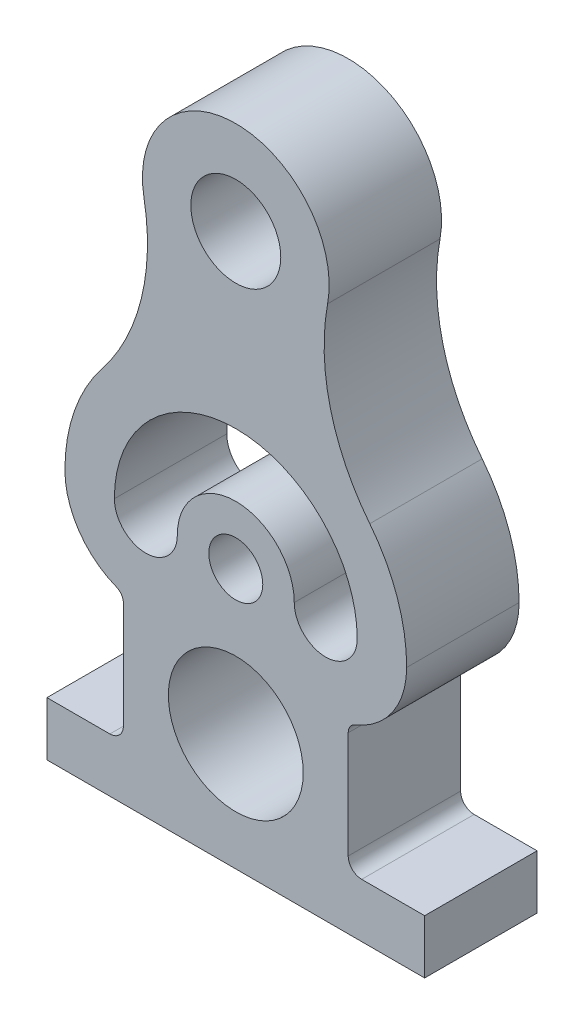
ISO-10303-21;
HEADER;
FILE_DESCRIPTION(('STEP AP214'),'2;1');
FILE_NAME('part.step','',(''),(''),'','','');
FILE_SCHEMA(('AUTOMOTIVE_DESIGN { 1 0 10303 214 1 1 1 1 }'));
ENDSEC;
DATA;
#1=APPLICATION_CONTEXT('core data for automotive mechanical design processes');
#2=APPLICATION_PROTOCOL_DEFINITION('international standard','automotive_design',2000,#1);
#3=PRODUCT_CONTEXT('',#1,'mechanical');
#4=PRODUCT('Part','Part','',(#3));
#5=PRODUCT_RELATED_PRODUCT_CATEGORY('part','',(#4));
#6=PRODUCT_DEFINITION_FORMATION('','',#4);
#7=PRODUCT_DEFINITION_CONTEXT('part definition',#1,'design');
#8=PRODUCT_DEFINITION('design','',#6,#7);
#9=PRODUCT_DEFINITION_SHAPE('','',#8);
#10=(LENGTH_UNIT() NAMED_UNIT(*) SI_UNIT(.MILLI.,.METRE.));
#11=(NAMED_UNIT(*) PLANE_ANGLE_UNIT() SI_UNIT($,.RADIAN.));
#12=(NAMED_UNIT(*) SI_UNIT($,.STERADIAN.) SOLID_ANGLE_UNIT());
#13=UNCERTAINTY_MEASURE_WITH_UNIT(LENGTH_MEASURE(1.E-05),#10,'distance_accuracy_value','');
#14=(GEOMETRIC_REPRESENTATION_CONTEXT(3) GLOBAL_UNCERTAINTY_ASSIGNED_CONTEXT((#13)) GLOBAL_UNIT_ASSIGNED_CONTEXT((#10,
#11,#12)) REPRESENTATION_CONTEXT('',''));
#15=CARTESIAN_POINT('',(0.,0.,0.));
#16=DIRECTION('',(0.,0.,1.));
#17=DIRECTION('',(1.,0.,0.));
#18=AXIS2_PLACEMENT_3D('',#15,#16,#17);
#19=CARTESIAN_POINT('',(44.,115.613648262946,50.));
#20=DIRECTION('',(0.,0.,1.));
#21=DIRECTION('',(1.,0.,0.));
#22=AXIS2_PLACEMENT_3D('',#19,#20,#21);
#23=PLANE('',#22);
#24=CARTESIAN_POINT('',(84.,115.613648262946,50.));
#25=DIRECTION('',(0.,0.,-1.));
#26=DIRECTION('',(1.,0.,0.));
#27=AXIS2_PLACEMENT_3D('',#24,#25,#26);
#28=CIRCLE('',#27,26.);
#29=CARTESIAN_POINT('',(58.,115.613648262946,50.));
#30=VERTEX_POINT('',#29);
#31=CARTESIAN_POINT('',(110.,115.613648262946,50.));
#32=VERTEX_POINT('',#31);
#33=EDGE_CURVE('E192',#30,#32,#28,.T.);
#34=ORIENTED_EDGE('',*,*,#33,.F.);
#35=CARTESIAN_POINT('',(44.,115.613648262946,50.));
#36=DIRECTION('',(0.,0.,1.));
#37=DIRECTION('',(1.,0.,0.));
#38=AXIS2_PLACEMENT_3D('',#35,#36,#37);
#39=CIRCLE('',#38,14.);
#40=CARTESIAN_POINT('',(30.,115.613648262946,50.));
#41=VERTEX_POINT('',#40);
#42=EDGE_CURVE('E182',#41,#30,#39,.T.);
#43=ORIENTED_EDGE('',*,*,#42,.F.);
#44=CARTESIAN_POINT('',(84.,115.613648262946,50.));
#45=DIRECTION('',(0.,0.,1.));
#46=DIRECTION('',(1.,0.,0.));
#47=AXIS2_PLACEMENT_3D('',#44,#45,#46);
#48=CIRCLE('',#47,54.);
#49=CARTESIAN_POINT('',(138.,115.613648262946,50.));
#50=VERTEX_POINT('',#49);
#51=EDGE_CURVE('E208',#50,#41,#48,.T.);
#52=ORIENTED_EDGE('',*,*,#51,.F.);
#53=CARTESIAN_POINT('',(124.,115.613648262946,50.));
#54=DIRECTION('',(0.,0.,1.));
#55=DIRECTION('',(1.,0.,0.));
#56=AXIS2_PLACEMENT_3D('',#53,#54,#55);
#57=CIRCLE('',#56,14.);
#58=EDGE_CURVE('E206',#32,#50,#57,.T.);
#59=ORIENTED_EDGE('',*,*,#58,.F.);
#60=EDGE_LOOP('',(#34,#43,#52,#59));
#61=FACE_BOUND('',#60,.T.);
#62=CARTESIAN_POINT('',(84.,52.,50.));
#63=DIRECTION('',(0.,0.,1.));
#64=DIRECTION('',(1.,0.,0.));
#65=AXIS2_PLACEMENT_3D('',#62,#63,#64);
#66=CIRCLE('',#65,30.);
#67=CARTESIAN_POINT('',(114.,52.,50.));
#68=VERTEX_POINT('',#67);
#69=EDGE_CURVE('E226',#68,#68,#66,.T.);
#70=ORIENTED_EDGE('',*,*,#69,.F.);
#71=EDGE_LOOP('',(#70));
#72=FACE_BOUND('',#71,.T.);
#73=DIRECTION('',(0.,-1.,0.));
#74=VECTOR('',#73,1.);
#75=CARTESIAN_POINT('',(0.,0.,50.));
#76=LINE('',#75,#74);
#77=CARTESIAN_POINT('',(0.,24.,50.));
#78=VERTEX_POINT('',#77);
#79=CARTESIAN_POINT('',(0.,0.,50.));
#80=VERTEX_POINT('',#79);
#81=EDGE_CURVE('E238',#78,#80,#76,.T.);
#82=ORIENTED_EDGE('',*,*,#81,.T.);
#83=DIRECTION('',(1.,0.,0.));
#84=VECTOR('',#83,1.);
#85=CARTESIAN_POINT('',(0.,0.,50.));
#86=LINE('',#85,#84);
#87=CARTESIAN_POINT('',(168.,0.,50.));
#88=VERTEX_POINT('',#87);
#89=EDGE_CURVE('E241',#80,#88,#86,.T.);
#90=ORIENTED_EDGE('',*,*,#89,.T.);
#91=DIRECTION('',(0.,1.,0.));
#92=VECTOR('',#91,1.);
#93=CARTESIAN_POINT('',(168.,0.,50.));
#94=LINE('',#93,#92);
#95=CARTESIAN_POINT('',(168.,24.,50.));
#96=VERTEX_POINT('',#95);
#97=EDGE_CURVE('E244',#88,#96,#94,.T.);
#98=ORIENTED_EDGE('',*,*,#97,.T.);
#99=DIRECTION('',(-1.,0.,0.));
#100=VECTOR('',#99,1.);
#101=CARTESIAN_POINT('',(168.,24.,50.));
#102=LINE('',#101,#100);
#103=CARTESIAN_POINT('',(140.,24.,50.));
#104=VERTEX_POINT('',#103);
#105=EDGE_CURVE('E246',#96,#104,#102,.T.);
#106=ORIENTED_EDGE('',*,*,#105,.T.);
#107=CARTESIAN_POINT('',(140.,30.,50.));
#108=DIRECTION('',(0.,0.,1.));
#109=DIRECTION('',(1.,0.,0.));
#110=AXIS2_PLACEMENT_3D('',#107,#108,#109);
#111=CIRCLE('',#110,6.);
#112=CARTESIAN_POINT('',(134.,30.,50.));
#113=VERTEX_POINT('',#112);
#114=EDGE_CURVE('E347',#104,#113,#111,.F.);
#115=ORIENTED_EDGE('',*,*,#114,.T.);
#116=DIRECTION('',(0.,1.,0.));
#117=VECTOR('',#116,1.);
#118=CARTESIAN_POINT('',(134.,24.,50.));
#119=LINE('',#118,#117);
#120=CARTESIAN_POINT('',(134.,77.4560802062682,50.));
#121=VERTEX_POINT('',#120);
#122=EDGE_CURVE('E249',#113,#121,#119,.T.);
#123=ORIENTED_EDGE('',*,*,#122,.T.);
#124=CARTESIAN_POINT('',(139.,77.4560802062682,50.));
#125=DIRECTION('',(0.,0.,1.));
#126=DIRECTION('',(1.,0.,0.));
#127=AXIS2_PLACEMENT_3D('',#124,#125,#126);
#128=CIRCLE('',#127,5.);
#129=CARTESIAN_POINT('',(137.170731707317,82.1094421643996,50.));
#130=VERTEX_POINT('',#129);
#131=EDGE_CURVE('E11',#121,#130,#128,.F.);
#132=ORIENTED_EDGE('',*,*,#131,.T.);
#133=CARTESIAN_POINT('',(124.,115.613648262946,50.));
#134=DIRECTION('',(0.,0.,1.));
#135=DIRECTION('',(1.,0.,0.));
#136=AXIS2_PLACEMENT_3D('',#133,#134,#135);
#137=CIRCLE('',#136,36.);
#138=CARTESIAN_POINT('',(160.,115.613648262946,50.));
#139=VERTEX_POINT('',#138);
#140=EDGE_CURVE('E251',#130,#139,#137,.T.);
#141=ORIENTED_EDGE('',*,*,#140,.T.);
#142=CARTESIAN_POINT('',(84.,115.613648262946,50.));
#143=DIRECTION('',(0.,0.,1.));
#144=DIRECTION('',(1.,0.,0.));
#145=AXIS2_PLACEMENT_3D('',#142,#143,#144);
#146=CIRCLE('',#145,76.);
#147=CARTESIAN_POINT('',(143.589021464897,162.785128214884,50.));
#148=VERTEX_POINT('',#147);
#149=EDGE_CURVE('E253',#139,#148,#146,.T.);
#150=ORIENTED_EDGE('',*,*,#149,.T.);
#151=CARTESIAN_POINT('',(217.291232224111,221.128800787018,50.));
#152=DIRECTION('',(0.,0.,-1.));
#153=DIRECTION('',(1.,0.,0.));
#154=AXIS2_PLACEMENT_3D('',#151,#152,#153);
#155=CIRCLE('',#154,94.);
#156=CARTESIAN_POINT('',(124.838141772332,238.111911983588,50.));
#157=VERTEX_POINT('',#156);
#158=EDGE_CURVE('E255',#148,#157,#155,.T.);
#159=ORIENTED_EDGE('',*,*,#158,.T.);
#160=CARTESIAN_POINT('',(84.,245.613648262946,50.));
#161=DIRECTION('',(0.,0.,1.));
#162=DIRECTION('',(1.,0.,0.));
#163=AXIS2_PLACEMENT_3D('',#160,#161,#162);
#164=CIRCLE('',#163,41.5214386868048);
#165=CARTESIAN_POINT('',(43.1618582276683,238.111911983588,50.));
#166=VERTEX_POINT('',#165);
#167=EDGE_CURVE('E257',#157,#166,#164,.T.);
#168=ORIENTED_EDGE('',*,*,#167,.T.);
#169=CARTESIAN_POINT('',(-49.2912322241111,221.128800787018,50.));
#170=DIRECTION('',(0.,0.,-1.));
#171=DIRECTION('',(1.,0.,0.));
#172=AXIS2_PLACEMENT_3D('',#169,#170,#171);
#173=CIRCLE('',#172,94.);
#174=CARTESIAN_POINT('',(24.4109785351032,162.785128214884,50.));
#175=VERTEX_POINT('',#174);
#176=EDGE_CURVE('E259',#166,#175,#173,.T.);
#177=ORIENTED_EDGE('',*,*,#176,.T.);
#178=CARTESIAN_POINT('',(84.,115.613648262946,50.));
#179=DIRECTION('',(0.,0.,1.));
#180=DIRECTION('',(1.,0.,0.));
#181=AXIS2_PLACEMENT_3D('',#178,#179,#180);
#182=CIRCLE('',#181,76.);
#183=CARTESIAN_POINT('',(7.99999999999999,115.613648262946,50.));
#184=VERTEX_POINT('',#183);
#185=EDGE_CURVE('E261',#175,#184,#182,.T.);
#186=ORIENTED_EDGE('',*,*,#185,.T.);
#187=CARTESIAN_POINT('',(44.,115.613648262946,50.));
#188=DIRECTION('',(0.,0.,1.));
#189=DIRECTION('',(1.,0.,0.));
#190=AXIS2_PLACEMENT_3D('',#187,#188,#189);
#191=CIRCLE('',#190,36.);
#192=CARTESIAN_POINT('',(30.8292682926829,82.1094421643996,50.));
#193=VERTEX_POINT('',#192);
#194=EDGE_CURVE('E263',#184,#193,#191,.T.);
#195=ORIENTED_EDGE('',*,*,#194,.T.);
#196=CARTESIAN_POINT('',(29.,77.4560802062682,50.));
#197=DIRECTION('',(0.,0.,1.));
#198=DIRECTION('',(1.,0.,0.));
#199=AXIS2_PLACEMENT_3D('',#196,#197,#198);
#200=CIRCLE('',#199,5.);
#201=CARTESIAN_POINT('',(34.,77.4560802062682,50.));
#202=VERTEX_POINT('',#201);
#203=EDGE_CURVE('E360',#193,#202,#200,.F.);
#204=ORIENTED_EDGE('',*,*,#203,.T.);
#205=DIRECTION('',(0.,-1.,0.));
#206=VECTOR('',#205,1.);
#207=CARTESIAN_POINT('',(34.,24.,50.));
#208=LINE('',#207,#206);
#209=CARTESIAN_POINT('',(34.,30.,50.));
#210=VERTEX_POINT('',#209);
#211=EDGE_CURVE('E266',#202,#210,#208,.T.);
#212=ORIENTED_EDGE('',*,*,#211,.T.);
#213=CARTESIAN_POINT('',(28.,30.,50.));
#214=DIRECTION('',(0.,0.,1.));
#215=DIRECTION('',(1.,0.,0.));
#216=AXIS2_PLACEMENT_3D('',#213,#214,#215);
#217=CIRCLE('',#216,6.);
#218=CARTESIAN_POINT('',(28.,24.,50.));
#219=VERTEX_POINT('',#218);
#220=EDGE_CURVE('E343',#210,#219,#217,.F.);
#221=ORIENTED_EDGE('',*,*,#220,.T.);
#222=DIRECTION('',(-1.,0.,0.));
#223=VECTOR('',#222,1.);
#224=CARTESIAN_POINT('',(0.,24.,50.));
#225=LINE('',#224,#223);
#226=EDGE_CURVE('E268',#219,#78,#225,.T.);
#227=ORIENTED_EDGE('',*,*,#226,.T.);
#228=EDGE_LOOP('',(#82,#90,#98,#106,#115,#123,#132,#141,#150,#159,#168,#177,#186,#195,#204,#212,
#221,#227));
#229=FACE_BOUND('',#228,.T.);
#230=CARTESIAN_POINT('',(84.,245.613648262946,50.));
#231=DIRECTION('',(0.,0.,1.));
#232=DIRECTION('',(1.,0.,0.));
#233=AXIS2_PLACEMENT_3D('',#230,#231,#232);
#234=CIRCLE('',#233,20.);
#235=CARTESIAN_POINT('',(104.,245.613648262946,50.));
#236=VERTEX_POINT('',#235);
#237=EDGE_CURVE('E232',#236,#236,#234,.T.);
#238=ORIENTED_EDGE('',*,*,#237,.F.);
#239=EDGE_LOOP('',(#238));
#240=FACE_BOUND('',#239,.T.);
#241=CARTESIAN_POINT('',(84.,115.613648262946,50.));
#242=DIRECTION('',(0.,0.,1.));
#243=DIRECTION('',(1.,0.,0.));
#244=AXIS2_PLACEMENT_3D('',#241,#242,#243);
#245=CIRCLE('',#244,12.);
#246=CARTESIAN_POINT('',(96.,115.613648262946,50.));
#247=VERTEX_POINT('',#246);
#248=EDGE_CURVE('E215',#247,#247,#245,.T.);
#249=ORIENTED_EDGE('',*,*,#248,.F.);
#250=EDGE_LOOP('',(#249));
#251=FACE_BOUND('',#250,.T.);
#252=ADVANCED_FACE('F32',(#61,#72,#229,#240,#251),#23,.T.);
#253=CARTESIAN_POINT('',(44.,115.613648262946,0.));
#254=DIRECTION('',(0.,0.,1.));
#255=DIRECTION('',(1.,0.,0.));
#256=AXIS2_PLACEMENT_3D('',#253,#254,#255);
#257=PLANE('',#256);
#258=CARTESIAN_POINT('',(84.,52.,0.));
#259=DIRECTION('',(0.,0.,1.));
#260=DIRECTION('',(1.,0.,0.));
#261=AXIS2_PLACEMENT_3D('',#258,#259,#260);
#262=CIRCLE('',#261,30.);
#263=CARTESIAN_POINT('',(114.,52.,0.));
#264=VERTEX_POINT('',#263);
#265=EDGE_CURVE('E200',#264,#264,#262,.T.);
#266=ORIENTED_EDGE('',*,*,#265,.T.);
#267=EDGE_LOOP('',(#266));
#268=FACE_BOUND('',#267,.T.);
#269=CARTESIAN_POINT('',(84.,245.613648262946,0.));
#270=DIRECTION('',(0.,0.,1.));
#271=DIRECTION('',(1.,0.,0.));
#272=AXIS2_PLACEMENT_3D('',#269,#270,#271);
#273=CIRCLE('',#272,20.);
#274=CARTESIAN_POINT('',(104.,245.613648262946,0.));
#275=VERTEX_POINT('',#274);
#276=EDGE_CURVE('E229',#275,#275,#273,.T.);
#277=ORIENTED_EDGE('',*,*,#276,.T.);
#278=EDGE_LOOP('',(#277));
#279=FACE_BOUND('',#278,.T.);
#280=DIRECTION('',(0.,-1.,0.));
#281=VECTOR('',#280,1.);
#282=CARTESIAN_POINT('',(0.,0.,0.));
#283=LINE('',#282,#281);
#284=CARTESIAN_POINT('',(0.,24.,0.));
#285=VERTEX_POINT('',#284);
#286=CARTESIAN_POINT('',(0.,0.,0.));
#287=VERTEX_POINT('',#286);
#288=EDGE_CURVE('E235',#285,#287,#283,.T.);
#289=ORIENTED_EDGE('',*,*,#288,.F.);
#290=DIRECTION('',(-1.,0.,0.));
#291=VECTOR('',#290,1.);
#292=CARTESIAN_POINT('',(0.,24.,0.));
#293=LINE('',#292,#291);
#294=CARTESIAN_POINT('',(28.,24.,0.));
#295=VERTEX_POINT('',#294);
#296=EDGE_CURVE('E242',#295,#285,#293,.T.);
#297=ORIENTED_EDGE('',*,*,#296,.F.);
#298=CARTESIAN_POINT('',(28.,30.,0.));
#299=DIRECTION('',(0.,0.,1.));
#300=DIRECTION('',(1.,0.,0.));
#301=AXIS2_PLACEMENT_3D('',#298,#299,#300);
#302=CIRCLE('',#301,6.);
#303=CARTESIAN_POINT('',(34.,30.,0.));
#304=VERTEX_POINT('',#303);
#305=EDGE_CURVE('E340',#295,#304,#302,.T.);
#306=ORIENTED_EDGE('',*,*,#305,.T.);
#307=DIRECTION('',(0.,-1.,0.));
#308=VECTOR('',#307,1.);
#309=CARTESIAN_POINT('',(34.,24.,0.));
#310=LINE('',#309,#308);
#311=CARTESIAN_POINT('',(34.,77.4560802062682,0.));
#312=VERTEX_POINT('',#311);
#313=EDGE_CURVE('E297',#312,#304,#310,.T.);
#314=ORIENTED_EDGE('',*,*,#313,.F.);
#315=CARTESIAN_POINT('',(29.,77.4560802062682,0.));
#316=DIRECTION('',(0.,0.,1.));
#317=DIRECTION('',(1.,0.,0.));
#318=AXIS2_PLACEMENT_3D('',#315,#316,#317);
#319=CIRCLE('',#318,5.);
#320=CARTESIAN_POINT('',(30.8292682926829,82.1094421643996,0.));
#321=VERTEX_POINT('',#320);
#322=EDGE_CURVE('E358',#312,#321,#319,.T.);
#323=ORIENTED_EDGE('',*,*,#322,.T.);
#324=CARTESIAN_POINT('',(44.,115.613648262946,0.));
#325=DIRECTION('',(0.,0.,1.));
#326=DIRECTION('',(1.,0.,0.));
#327=AXIS2_PLACEMENT_3D('',#324,#325,#326);
#328=CIRCLE('',#327,36.);
#329=CARTESIAN_POINT('',(7.99999999999999,115.613648262946,0.));
#330=VERTEX_POINT('',#329);
#331=EDGE_CURVE('E294',#330,#321,#328,.T.);
#332=ORIENTED_EDGE('',*,*,#331,.F.);
#333=CARTESIAN_POINT('',(84.,115.613648262946,0.));
#334=DIRECTION('',(0.,0.,1.));
#335=DIRECTION('',(1.,0.,0.));
#336=AXIS2_PLACEMENT_3D('',#333,#334,#335);
#337=CIRCLE('',#336,76.);
#338=CARTESIAN_POINT('',(24.4109785351032,162.785128214884,0.));
#339=VERTEX_POINT('',#338);
#340=EDGE_CURVE('E292',#339,#330,#337,.T.);
#341=ORIENTED_EDGE('',*,*,#340,.F.);
#342=CARTESIAN_POINT('',(-49.2912322241111,221.128800787018,0.));
#343=DIRECTION('',(0.,0.,-1.));
#344=DIRECTION('',(1.,0.,0.));
#345=AXIS2_PLACEMENT_3D('',#342,#343,#344);
#346=CIRCLE('',#345,94.);
#347=CARTESIAN_POINT('',(43.1618582276683,238.111911983588,0.));
#348=VERTEX_POINT('',#347);
#349=EDGE_CURVE('E290',#348,#339,#346,.T.);
#350=ORIENTED_EDGE('',*,*,#349,.F.);
#351=CARTESIAN_POINT('',(84.,245.613648262946,0.));
#352=DIRECTION('',(0.,0.,1.));
#353=DIRECTION('',(1.,0.,0.));
#354=AXIS2_PLACEMENT_3D('',#351,#352,#353);
#355=CIRCLE('',#354,41.5214386868048);
#356=CARTESIAN_POINT('',(124.838141772332,238.111911983588,0.));
#357=VERTEX_POINT('',#356);
#358=EDGE_CURVE('E288',#357,#348,#355,.T.);
#359=ORIENTED_EDGE('',*,*,#358,.F.);
#360=CARTESIAN_POINT('',(217.291232224111,221.128800787018,0.));
#361=DIRECTION('',(0.,0.,-1.));
#362=DIRECTION('',(1.,0.,0.));
#363=AXIS2_PLACEMENT_3D('',#360,#361,#362);
#364=CIRCLE('',#363,94.);
#365=CARTESIAN_POINT('',(143.589021464897,162.785128214884,0.));
#366=VERTEX_POINT('',#365);
#367=EDGE_CURVE('E286',#366,#357,#364,.T.);
#368=ORIENTED_EDGE('',*,*,#367,.F.);
#369=CARTESIAN_POINT('',(84.,115.613648262946,0.));
#370=DIRECTION('',(0.,0.,1.));
#371=DIRECTION('',(1.,0.,0.));
#372=AXIS2_PLACEMENT_3D('',#369,#370,#371);
#373=CIRCLE('',#372,76.);
#374=CARTESIAN_POINT('',(160.,115.613648262946,0.));
#375=VERTEX_POINT('',#374);
#376=EDGE_CURVE('E284',#375,#366,#373,.T.);
#377=ORIENTED_EDGE('',*,*,#376,.F.);
#378=CARTESIAN_POINT('',(124.,115.613648262946,0.));
#379=DIRECTION('',(0.,0.,1.));
#380=DIRECTION('',(1.,0.,0.));
#381=AXIS2_PLACEMENT_3D('',#378,#379,#380);
#382=CIRCLE('',#381,36.);
#383=CARTESIAN_POINT('',(137.170731707317,82.1094421643996,0.));
#384=VERTEX_POINT('',#383);
#385=EDGE_CURVE('E282',#384,#375,#382,.T.);
#386=ORIENTED_EDGE('',*,*,#385,.F.);
#387=CARTESIAN_POINT('',(139.,77.4560802062682,0.));
#388=DIRECTION('',(0.,0.,1.));
#389=DIRECTION('',(1.,0.,0.));
#390=AXIS2_PLACEMENT_3D('',#387,#388,#389);
#391=CIRCLE('',#390,5.);
#392=CARTESIAN_POINT('',(134.,77.4560802062682,0.));
#393=VERTEX_POINT('',#392);
#394=EDGE_CURVE('E40',#384,#393,#391,.T.);
#395=ORIENTED_EDGE('',*,*,#394,.T.);
#396=DIRECTION('',(0.,1.,0.));
#397=VECTOR('',#396,1.);
#398=CARTESIAN_POINT('',(134.,24.,0.));
#399=LINE('',#398,#397);
#400=CARTESIAN_POINT('',(134.,30.,0.));
#401=VERTEX_POINT('',#400);
#402=EDGE_CURVE('E280',#401,#393,#399,.T.);
#403=ORIENTED_EDGE('',*,*,#402,.F.);
#404=CARTESIAN_POINT('',(140.,30.,0.));
#405=DIRECTION('',(0.,0.,1.));
#406=DIRECTION('',(1.,0.,0.));
#407=AXIS2_PLACEMENT_3D('',#404,#405,#406);
#408=CIRCLE('',#407,6.);
#409=CARTESIAN_POINT('',(140.,24.,0.));
#410=VERTEX_POINT('',#409);
#411=EDGE_CURVE('E345',#401,#410,#408,.T.);
#412=ORIENTED_EDGE('',*,*,#411,.T.);
#413=DIRECTION('',(-1.,0.,0.));
#414=VECTOR('',#413,1.);
#415=CARTESIAN_POINT('',(168.,24.,0.));
#416=LINE('',#415,#414);
#417=CARTESIAN_POINT('',(168.,24.,0.));
#418=VERTEX_POINT('',#417);
#419=EDGE_CURVE('E277',#418,#410,#416,.T.);
#420=ORIENTED_EDGE('',*,*,#419,.F.);
#421=DIRECTION('',(0.,1.,0.));
#422=VECTOR('',#421,1.);
#423=CARTESIAN_POINT('',(168.,0.,0.));
#424=LINE('',#423,#422);
#425=CARTESIAN_POINT('',(168.,0.,0.));
#426=VERTEX_POINT('',#425);
#427=EDGE_CURVE('E275',#426,#418,#424,.T.);
#428=ORIENTED_EDGE('',*,*,#427,.F.);
#429=DIRECTION('',(1.,0.,0.));
#430=VECTOR('',#429,1.);
#431=CARTESIAN_POINT('',(0.,0.,0.));
#432=LINE('',#431,#430);
#433=EDGE_CURVE('E273',#287,#426,#432,.T.);
#434=ORIENTED_EDGE('',*,*,#433,.F.);
#435=EDGE_LOOP('',(#289,#297,#306,#314,#323,#332,#341,#350,#359,#368,#377,#386,#395,#403,#412,
#420,#428,#434));
#436=FACE_BOUND('',#435,.T.);
#437=CARTESIAN_POINT('',(44.,115.613648262946,0.));
#438=DIRECTION('',(0.,0.,1.));
#439=DIRECTION('',(1.,0.,0.));
#440=AXIS2_PLACEMENT_3D('',#437,#438,#439);
#441=CIRCLE('',#440,14.);
#442=CARTESIAN_POINT('',(30.,115.613648262946,0.));
#443=VERTEX_POINT('',#442);
#444=CARTESIAN_POINT('',(58.,115.613648262946,0.));
#445=VERTEX_POINT('',#444);
#446=EDGE_CURVE('E213',#443,#445,#441,.T.);
#447=ORIENTED_EDGE('',*,*,#446,.T.);
#448=CARTESIAN_POINT('',(84.,115.613648262946,0.));
#449=DIRECTION('',(0.,0.,-1.));
#450=DIRECTION('',(1.,0.,0.));
#451=AXIS2_PLACEMENT_3D('',#448,#449,#450);
#452=CIRCLE('',#451,26.);
#453=CARTESIAN_POINT('',(110.,115.613648262946,0.));
#454=VERTEX_POINT('',#453);
#455=EDGE_CURVE('E199',#445,#454,#452,.T.);
#456=ORIENTED_EDGE('',*,*,#455,.T.);
#457=CARTESIAN_POINT('',(124.,115.613648262946,0.));
#458=DIRECTION('',(0.,0.,1.));
#459=DIRECTION('',(1.,0.,0.));
#460=AXIS2_PLACEMENT_3D('',#457,#458,#459);
#461=CIRCLE('',#460,14.);
#462=CARTESIAN_POINT('',(138.,115.613648262946,0.));
#463=VERTEX_POINT('',#462);
#464=EDGE_CURVE('E217',#454,#463,#461,.T.);
#465=ORIENTED_EDGE('',*,*,#464,.T.);
#466=CARTESIAN_POINT('',(84.,115.613648262946,0.));
#467=DIRECTION('',(0.,0.,1.));
#468=DIRECTION('',(1.,0.,0.));
#469=AXIS2_PLACEMENT_3D('',#466,#467,#468);
#470=CIRCLE('',#469,54.);
#471=EDGE_CURVE('E193',#463,#443,#470,.T.);
#472=ORIENTED_EDGE('',*,*,#471,.T.);
#473=EDGE_LOOP('',(#447,#456,#465,#472));
#474=FACE_BOUND('',#473,.T.);
#475=CARTESIAN_POINT('',(84.,115.613648262946,0.));
#476=DIRECTION('',(0.,0.,1.));
#477=DIRECTION('',(1.,0.,0.));
#478=AXIS2_PLACEMENT_3D('',#475,#476,#477);
#479=CIRCLE('',#478,12.);
#480=CARTESIAN_POINT('',(96.,115.613648262946,0.));
#481=VERTEX_POINT('',#480);
#482=EDGE_CURVE('E685',#481,#481,#479,.T.);
#483=ORIENTED_EDGE('',*,*,#482,.T.);
#484=EDGE_LOOP('',(#483));
#485=FACE_BOUND('',#484,.T.);
#486=ADVANCED_FACE('F377',(#268,#279,#436,#474,#485),#257,.F.);
#487=CARTESIAN_POINT('',(0.,0.,50.));
#488=DIRECTION('',(1.,0.,0.));
#489=DIRECTION('',(0.,0.,-1.));
#490=AXIS2_PLACEMENT_3D('',#487,#488,#489);
#491=PLANE('',#490);
#492=ORIENTED_EDGE('',*,*,#288,.T.);
#493=DIRECTION('',(0.,0.,-1.));
#494=VECTOR('',#493,1.);
#495=CARTESIAN_POINT('',(0.,0.,50.));
#496=LINE('',#495,#494);
#497=EDGE_CURVE('E326',#80,#287,#496,.T.);
#498=ORIENTED_EDGE('',*,*,#497,.F.);
#499=ORIENTED_EDGE('',*,*,#81,.F.);
#500=DIRECTION('',(0.,0.,-1.));
#501=VECTOR('',#500,1.);
#502=CARTESIAN_POINT('',(0.,24.,50.));
#503=LINE('',#502,#501);
#504=EDGE_CURVE('E270',#78,#285,#503,.T.);
#505=ORIENTED_EDGE('',*,*,#504,.T.);
#506=EDGE_LOOP('',(#492,#498,#499,#505));
#507=FACE_BOUND('',#506,.T.);
#508=ADVANCED_FACE('F435',(#507),#491,.F.);
#509=CARTESIAN_POINT('',(0.,0.,50.));
#510=DIRECTION('',(0.,1.,0.));
#511=DIRECTION('',(0.,0.,1.));
#512=AXIS2_PLACEMENT_3D('',#509,#510,#511);
#513=PLANE('',#512);
#514=ORIENTED_EDGE('',*,*,#433,.T.);
#515=DIRECTION('',(0.,0.,-1.));
#516=VECTOR('',#515,1.);
#517=CARTESIAN_POINT('',(168.,0.,50.));
#518=LINE('',#517,#516);
#519=EDGE_CURVE('E323',#88,#426,#518,.T.);
#520=ORIENTED_EDGE('',*,*,#519,.F.);
#521=ORIENTED_EDGE('',*,*,#89,.F.);
#522=ORIENTED_EDGE('',*,*,#497,.T.);
#523=EDGE_LOOP('',(#514,#520,#521,#522));
#524=FACE_BOUND('',#523,.T.);
#525=ADVANCED_FACE('F432',(#524),#513,.F.);
#526=CARTESIAN_POINT('',(168.,0.,50.));
#527=DIRECTION('',(-1.,0.,0.));
#528=DIRECTION('',(0.,0.,1.));
#529=AXIS2_PLACEMENT_3D('',#526,#527,#528);
#530=PLANE('',#529);
#531=ORIENTED_EDGE('',*,*,#427,.T.);
#532=DIRECTION('',(0.,0.,-1.));
#533=VECTOR('',#532,1.);
#534=CARTESIAN_POINT('',(168.,24.,50.));
#535=LINE('',#534,#533);
#536=EDGE_CURVE('E320',#96,#418,#535,.T.);
#537=ORIENTED_EDGE('',*,*,#536,.F.);
#538=ORIENTED_EDGE('',*,*,#97,.F.);
#539=ORIENTED_EDGE('',*,*,#519,.T.);
#540=EDGE_LOOP('',(#531,#537,#538,#539));
#541=FACE_BOUND('',#540,.T.);
#542=ADVANCED_FACE('F427',(#541),#530,.F.);
#543=CARTESIAN_POINT('',(168.,24.,50.));
#544=DIRECTION('',(0.,-1.,0.));
#545=DIRECTION('',(1.,0.,0.));
#546=AXIS2_PLACEMENT_3D('',#543,#544,#545);
#547=PLANE('',#546);
#548=ORIENTED_EDGE('',*,*,#419,.T.);
#549=DIRECTION('',(0.,0.,-1.));
#550=VECTOR('',#549,1.);
#551=CARTESIAN_POINT('',(140.,24.,50.));
#552=LINE('',#551,#550);
#553=EDGE_CURVE('E338',#410,#104,#552,.F.);
#554=ORIENTED_EDGE('',*,*,#553,.T.);
#555=ORIENTED_EDGE('',*,*,#105,.F.);
#556=ORIENTED_EDGE('',*,*,#536,.T.);
#557=EDGE_LOOP('',(#548,#554,#555,#556));
#558=FACE_BOUND('',#557,.T.);
#559=ADVANCED_FACE('F422',(#558),#547,.F.);
#560=CARTESIAN_POINT('',(134.,24.,50.));
#561=DIRECTION('',(-1.,0.,0.));
#562=DIRECTION('',(0.,0.,1.));
#563=AXIS2_PLACEMENT_3D('',#560,#561,#562);
#564=PLANE('',#563);
#565=ORIENTED_EDGE('',*,*,#402,.T.);
#566=DIRECTION('',(0.,0.,1.));
#567=VECTOR('',#566,1.);
#568=CARTESIAN_POINT('',(134.,77.4560802062682,50.));
#569=LINE('',#568,#567);
#570=EDGE_CURVE('E53',#393,#121,#569,.T.);
#571=ORIENTED_EDGE('',*,*,#570,.T.);
#572=ORIENTED_EDGE('',*,*,#122,.F.);
#573=DIRECTION('',(0.,0.,-1.));
#574=VECTOR('',#573,1.);
#575=CARTESIAN_POINT('',(134.,30.,0.));
#576=LINE('',#575,#574);
#577=EDGE_CURVE('E335',#113,#401,#576,.T.);
#578=ORIENTED_EDGE('',*,*,#577,.T.);
#579=EDGE_LOOP('',(#565,#571,#572,#578));
#580=FACE_BOUND('',#579,.T.);
#581=ADVANCED_FACE('F415',(#580),#564,.F.);
#582=CARTESIAN_POINT('',(124.,115.613648262946,50.));
#583=DIRECTION('',(0.,0.,-1.));
#584=DIRECTION('',(-1.,0.,0.));
#585=AXIS2_PLACEMENT_3D('',#582,#583,#584);
#586=CYLINDRICAL_SURFACE('',#585,36.);
#587=ORIENTED_EDGE('',*,*,#140,.F.);
#588=DIRECTION('',(0.,0.,-1.));
#589=VECTOR('',#588,1.);
#590=CARTESIAN_POINT('',(137.170731707317,82.1094421643996,50.));
#591=LINE('',#590,#589);
#592=EDGE_CURVE('E354',#130,#384,#591,.T.);
#593=ORIENTED_EDGE('',*,*,#592,.T.);
#594=ORIENTED_EDGE('',*,*,#385,.T.);
#595=DIRECTION('',(0.,0.,-1.));
#596=VECTOR('',#595,1.);
#597=CARTESIAN_POINT('',(160.,115.613648262946,50.));
#598=LINE('',#597,#596);
#599=EDGE_CURVE('E317',#139,#375,#598,.T.);
#600=ORIENTED_EDGE('',*,*,#599,.F.);
#601=EDGE_LOOP('',(#587,#593,#594,#600));
#602=FACE_BOUND('',#601,.T.);
#603=ADVANCED_FACE('F409',(#602),#586,.T.);
#604=CARTESIAN_POINT('',(84.,115.613648262946,50.));
#605=DIRECTION('',(0.,0.,-1.));
#606=DIRECTION('',(-1.,0.,0.));
#607=AXIS2_PLACEMENT_3D('',#604,#605,#606);
#608=CYLINDRICAL_SURFACE('',#607,76.);
#609=ORIENTED_EDGE('',*,*,#376,.T.);
#610=DIRECTION('',(0.,0.,-1.));
#611=VECTOR('',#610,1.);
#612=CARTESIAN_POINT('',(143.589021464897,162.785128214884,50.));
#613=LINE('',#612,#611);
#614=EDGE_CURVE('E314',#148,#366,#613,.T.);
#615=ORIENTED_EDGE('',*,*,#614,.F.);
#616=ORIENTED_EDGE('',*,*,#149,.F.);
#617=ORIENTED_EDGE('',*,*,#599,.T.);
#618=EDGE_LOOP('',(#609,#615,#616,#617));
#619=FACE_BOUND('',#618,.T.);
#620=ADVANCED_FACE('F404',(#619),#608,.T.);
#621=CARTESIAN_POINT('',(217.291232224111,221.128800787018,50.));
#622=DIRECTION('',(0.,0.,-1.));
#623=DIRECTION('',(-1.,0.,0.));
#624=AXIS2_PLACEMENT_3D('',#621,#622,#623);
#625=CYLINDRICAL_SURFACE('',#624,94.);
#626=ORIENTED_EDGE('',*,*,#367,.T.);
#627=DIRECTION('',(0.,0.,-1.));
#628=VECTOR('',#627,1.);
#629=CARTESIAN_POINT('',(124.838141772332,238.111911983588,50.));
#630=LINE('',#629,#628);
#631=EDGE_CURVE('E311',#157,#357,#630,.T.);
#632=ORIENTED_EDGE('',*,*,#631,.F.);
#633=ORIENTED_EDGE('',*,*,#158,.F.);
#634=ORIENTED_EDGE('',*,*,#614,.T.);
#635=EDGE_LOOP('',(#626,#632,#633,#634));
#636=FACE_BOUND('',#635,.T.);
#637=ADVANCED_FACE('F400',(#636),#625,.F.);
#638=CARTESIAN_POINT('',(84.,245.613648262946,50.));
#639=DIRECTION('',(0.,0.,-1.));
#640=DIRECTION('',(-1.,0.,0.));
#641=AXIS2_PLACEMENT_3D('',#638,#639,#640);
#642=CYLINDRICAL_SURFACE('',#641,41.5214386868048);
#643=ORIENTED_EDGE('',*,*,#358,.T.);
#644=DIRECTION('',(0.,0.,-1.));
#645=VECTOR('',#644,1.);
#646=CARTESIAN_POINT('',(43.1618582276683,238.111911983588,50.));
#647=LINE('',#646,#645);
#648=EDGE_CURVE('E308',#166,#348,#647,.T.);
#649=ORIENTED_EDGE('',*,*,#648,.F.);
#650=ORIENTED_EDGE('',*,*,#167,.F.);
#651=ORIENTED_EDGE('',*,*,#631,.T.);
#652=EDGE_LOOP('',(#643,#649,#650,#651));
#653=FACE_BOUND('',#652,.T.);
#654=ADVANCED_FACE('F396',(#653),#642,.T.);
#655=CARTESIAN_POINT('',(-49.2912322241111,221.128800787018,50.));
#656=DIRECTION('',(0.,0.,-1.));
#657=DIRECTION('',(-1.,0.,0.));
#658=AXIS2_PLACEMENT_3D('',#655,#656,#657);
#659=CYLINDRICAL_SURFACE('',#658,94.);
#660=ORIENTED_EDGE('',*,*,#349,.T.);
#661=DIRECTION('',(0.,0.,-1.));
#662=VECTOR('',#661,1.);
#663=CARTESIAN_POINT('',(24.4109785351032,162.785128214884,50.));
#664=LINE('',#663,#662);
#665=EDGE_CURVE('E305',#175,#339,#664,.T.);
#666=ORIENTED_EDGE('',*,*,#665,.F.);
#667=ORIENTED_EDGE('',*,*,#176,.F.);
#668=ORIENTED_EDGE('',*,*,#648,.T.);
#669=EDGE_LOOP('',(#660,#666,#667,#668));
#670=FACE_BOUND('',#669,.T.);
#671=ADVANCED_FACE('F391',(#670),#659,.F.);
#672=CARTESIAN_POINT('',(84.,115.613648262946,50.));
#673=DIRECTION('',(0.,0.,-1.));
#674=DIRECTION('',(-1.,0.,0.));
#675=AXIS2_PLACEMENT_3D('',#672,#673,#674);
#676=CYLINDRICAL_SURFACE('',#675,76.);
#677=ORIENTED_EDGE('',*,*,#340,.T.);
#678=DIRECTION('',(0.,0.,-1.));
#679=VECTOR('',#678,1.);
#680=CARTESIAN_POINT('',(7.99999999999999,115.613648262946,50.));
#681=LINE('',#680,#679);
#682=EDGE_CURVE('E302',#184,#330,#681,.T.);
#683=ORIENTED_EDGE('',*,*,#682,.F.);
#684=ORIENTED_EDGE('',*,*,#185,.F.);
#685=ORIENTED_EDGE('',*,*,#665,.T.);
#686=EDGE_LOOP('',(#677,#683,#684,#685));
#687=FACE_BOUND('',#686,.T.);
#688=ADVANCED_FACE('F385',(#687),#676,.T.);
#689=CARTESIAN_POINT('',(44.,115.613648262946,50.));
#690=DIRECTION('',(0.,0.,-1.));
#691=DIRECTION('',(-1.,0.,0.));
#692=AXIS2_PLACEMENT_3D('',#689,#690,#691);
#693=CYLINDRICAL_SURFACE('',#692,36.);
#694=ORIENTED_EDGE('',*,*,#331,.T.);
#695=DIRECTION('',(0.,0.,-1.));
#696=VECTOR('',#695,1.);
#697=CARTESIAN_POINT('',(30.8292682926829,82.1094421643996,50.));
#698=LINE('',#697,#696);
#699=EDGE_CURVE('E352',#321,#193,#698,.F.);
#700=ORIENTED_EDGE('',*,*,#699,.T.);
#701=ORIENTED_EDGE('',*,*,#194,.F.);
#702=ORIENTED_EDGE('',*,*,#682,.T.);
#703=EDGE_LOOP('',(#694,#700,#701,#702));
#704=FACE_BOUND('',#703,.T.);
#705=ADVANCED_FACE('F381',(#704),#693,.T.);
#706=CARTESIAN_POINT('',(34.,24.,50.));
#707=DIRECTION('',(1.,0.,0.));
#708=DIRECTION('',(0.,0.,-1.));
#709=AXIS2_PLACEMENT_3D('',#706,#707,#708);
#710=PLANE('',#709);
#711=ORIENTED_EDGE('',*,*,#211,.F.);
#712=DIRECTION('',(0.,0.,1.));
#713=VECTOR('',#712,1.);
#714=CARTESIAN_POINT('',(34.,77.4560802062682,0.));
#715=LINE('',#714,#713);
#716=EDGE_CURVE('E349',#202,#312,#715,.F.);
#717=ORIENTED_EDGE('',*,*,#716,.T.);
#718=ORIENTED_EDGE('',*,*,#313,.T.);
#719=DIRECTION('',(0.,0.,-1.));
#720=VECTOR('',#719,1.);
#721=CARTESIAN_POINT('',(34.,30.,50.));
#722=LINE('',#721,#720);
#723=EDGE_CURVE('E332',#304,#210,#722,.F.);
#724=ORIENTED_EDGE('',*,*,#723,.T.);
#725=EDGE_LOOP('',(#711,#717,#718,#724));
#726=FACE_BOUND('',#725,.T.);
#727=ADVANCED_FACE('F370',(#726),#710,.F.);
#728=CARTESIAN_POINT('',(0.,24.,50.));
#729=DIRECTION('',(0.,-1.,0.));
#730=DIRECTION('',(0.,0.,-1.));
#731=AXIS2_PLACEMENT_3D('',#728,#729,#730);
#732=PLANE('',#731);
#733=ORIENTED_EDGE('',*,*,#226,.F.);
#734=DIRECTION('',(0.,0.,-1.));
#735=VECTOR('',#734,1.);
#736=CARTESIAN_POINT('',(28.,24.,0.));
#737=LINE('',#736,#735);
#738=EDGE_CURVE('E329',#219,#295,#737,.T.);
#739=ORIENTED_EDGE('',*,*,#738,.T.);
#740=ORIENTED_EDGE('',*,*,#296,.T.);
#741=ORIENTED_EDGE('',*,*,#504,.F.);
#742=EDGE_LOOP('',(#733,#739,#740,#741));
#743=FACE_BOUND('',#742,.T.);
#744=ADVANCED_FACE('F439',(#743),#732,.F.);
#745=CARTESIAN_POINT('',(84.,245.613648262946,50.));
#746=DIRECTION('',(0.,0.,-1.));
#747=DIRECTION('',(-1.,0.,0.));
#748=AXIS2_PLACEMENT_3D('',#745,#746,#747);
#749=CYLINDRICAL_SURFACE('',#748,20.);
#750=ORIENTED_EDGE('',*,*,#237,.T.);
#751=EDGE_LOOP('',(#750));
#752=FACE_BOUND('',#751,.T.);
#753=ORIENTED_EDGE('',*,*,#276,.F.);
#754=EDGE_LOOP('',(#753));
#755=FACE_BOUND('',#754,.T.);
#756=ADVANCED_FACE('F463',(#752,#755),#749,.F.);
#757=CARTESIAN_POINT('',(84.,52.,50.));
#758=DIRECTION('',(0.,0.,-1.));
#759=DIRECTION('',(-1.,0.,0.));
#760=AXIS2_PLACEMENT_3D('',#757,#758,#759);
#761=CYLINDRICAL_SURFACE('',#760,30.);
#762=ORIENTED_EDGE('',*,*,#69,.T.);
#763=EDGE_LOOP('',(#762));
#764=FACE_BOUND('',#763,.T.);
#765=ORIENTED_EDGE('',*,*,#265,.F.);
#766=EDGE_LOOP('',(#765));
#767=FACE_BOUND('',#766,.T.);
#768=ADVANCED_FACE('F556',(#764,#767),#761,.F.);
#769=CARTESIAN_POINT('',(44.,115.613648262946,50.));
#770=DIRECTION('',(0.,0.,-1.));
#771=DIRECTION('',(-1.,0.,0.));
#772=AXIS2_PLACEMENT_3D('',#769,#770,#771);
#773=CYLINDRICAL_SURFACE('',#772,14.);
#774=ORIENTED_EDGE('',*,*,#446,.F.);
#775=DIRECTION('',(0.,0.,-1.));
#776=VECTOR('',#775,1.);
#777=CARTESIAN_POINT('',(30.,115.613648262946,50.));
#778=LINE('',#777,#776);
#779=EDGE_CURVE('E188',#41,#443,#778,.T.);
#780=ORIENTED_EDGE('',*,*,#779,.F.);
#781=ORIENTED_EDGE('',*,*,#42,.T.);
#782=DIRECTION('',(0.,0.,-1.));
#783=VECTOR('',#782,1.);
#784=CARTESIAN_POINT('',(58.,115.613648262946,50.));
#785=LINE('',#784,#783);
#786=EDGE_CURVE('E185',#30,#445,#785,.T.);
#787=ORIENTED_EDGE('',*,*,#786,.T.);
#788=EDGE_LOOP('',(#774,#780,#781,#787));
#789=FACE_BOUND('',#788,.T.);
#790=ADVANCED_FACE('F184',(#789),#773,.F.);
#791=CARTESIAN_POINT('',(84.,115.613648262946,50.));
#792=DIRECTION('',(0.,0.,-1.));
#793=DIRECTION('',(-1.,0.,0.));
#794=AXIS2_PLACEMENT_3D('',#791,#792,#793);
#795=CYLINDRICAL_SURFACE('',#794,26.);
#796=ORIENTED_EDGE('',*,*,#455,.F.);
#797=ORIENTED_EDGE('',*,*,#786,.F.);
#798=ORIENTED_EDGE('',*,*,#33,.T.);
#799=DIRECTION('',(0.,0.,-1.));
#800=VECTOR('',#799,1.);
#801=CARTESIAN_POINT('',(110.,115.613648262946,50.));
#802=LINE('',#801,#800);
#803=EDGE_CURVE('E201',#32,#454,#802,.T.);
#804=ORIENTED_EDGE('',*,*,#803,.T.);
#805=EDGE_LOOP('',(#796,#797,#798,#804));
#806=FACE_BOUND('',#805,.T.);
#807=ADVANCED_FACE('F196',(#806),#795,.T.);
#808=CARTESIAN_POINT('',(124.,115.613648262946,50.));
#809=DIRECTION('',(0.,0.,-1.));
#810=DIRECTION('',(-1.,0.,0.));
#811=AXIS2_PLACEMENT_3D('',#808,#809,#810);
#812=CYLINDRICAL_SURFACE('',#811,14.);
#813=ORIENTED_EDGE('',*,*,#464,.F.);
#814=ORIENTED_EDGE('',*,*,#803,.F.);
#815=ORIENTED_EDGE('',*,*,#58,.T.);
#816=DIRECTION('',(0.,0.,-1.));
#817=VECTOR('',#816,1.);
#818=CARTESIAN_POINT('',(138.,115.613648262946,50.));
#819=LINE('',#818,#817);
#820=EDGE_CURVE('E223',#50,#463,#819,.T.);
#821=ORIENTED_EDGE('',*,*,#820,.T.);
#822=EDGE_LOOP('',(#813,#814,#815,#821));
#823=FACE_BOUND('',#822,.T.);
#824=ADVANCED_FACE('F575',(#823),#812,.F.);
#825=CARTESIAN_POINT('',(84.,115.613648262946,50.));
#826=DIRECTION('',(0.,0.,-1.));
#827=DIRECTION('',(-1.,0.,0.));
#828=AXIS2_PLACEMENT_3D('',#825,#826,#827);
#829=CYLINDRICAL_SURFACE('',#828,54.);
#830=ORIENTED_EDGE('',*,*,#471,.F.);
#831=ORIENTED_EDGE('',*,*,#820,.F.);
#832=ORIENTED_EDGE('',*,*,#51,.T.);
#833=ORIENTED_EDGE('',*,*,#779,.T.);
#834=EDGE_LOOP('',(#830,#831,#832,#833));
#835=FACE_BOUND('',#834,.T.);
#836=ADVANCED_FACE('F451',(#835),#829,.F.);
#837=CARTESIAN_POINT('',(84.,115.613648262946,50.));
#838=DIRECTION('',(0.,0.,-1.));
#839=DIRECTION('',(-1.,0.,0.));
#840=AXIS2_PLACEMENT_3D('',#837,#838,#839);
#841=CYLINDRICAL_SURFACE('',#840,12.);
#842=ORIENTED_EDGE('',*,*,#248,.T.);
#843=EDGE_LOOP('',(#842));
#844=FACE_BOUND('',#843,.T.);
#845=ORIENTED_EDGE('',*,*,#482,.F.);
#846=EDGE_LOOP('',(#845));
#847=FACE_BOUND('',#846,.T.);
#848=ADVANCED_FACE('F444',(#844,#847),#841,.F.);
#849=CARTESIAN_POINT('',(28.,30.,50.));
#850=DIRECTION('',(0.,0.,1.));
#851=DIRECTION('',(1.,0.,0.));
#852=AXIS2_PLACEMENT_3D('',#849,#850,#851);
#853=CYLINDRICAL_SURFACE('',#852,6.);
#854=ORIENTED_EDGE('',*,*,#220,.F.);
#855=ORIENTED_EDGE('',*,*,#723,.F.);
#856=ORIENTED_EDGE('',*,*,#305,.F.);
#857=ORIENTED_EDGE('',*,*,#738,.F.);
#858=EDGE_LOOP('',(#854,#855,#856,#857));
#859=FACE_BOUND('',#858,.T.);
#860=ADVANCED_FACE('F442',(#859),#853,.F.);
#861=CARTESIAN_POINT('',(140.,30.,50.));
#862=DIRECTION('',(0.,0.,1.));
#863=DIRECTION('',(1.,0.,0.));
#864=AXIS2_PLACEMENT_3D('',#861,#862,#863);
#865=CYLINDRICAL_SURFACE('',#864,6.);
#866=ORIENTED_EDGE('',*,*,#114,.F.);
#867=ORIENTED_EDGE('',*,*,#553,.F.);
#868=ORIENTED_EDGE('',*,*,#411,.F.);
#869=ORIENTED_EDGE('',*,*,#577,.F.);
#870=EDGE_LOOP('',(#866,#867,#868,#869));
#871=FACE_BOUND('',#870,.T.);
#872=ADVANCED_FACE('F417',(#871),#865,.F.);
#873=CARTESIAN_POINT('',(29.,77.4560802062682,50.));
#874=DIRECTION('',(0.,0.,-1.));
#875=DIRECTION('',(-1.,0.,0.));
#876=AXIS2_PLACEMENT_3D('',#873,#874,#875);
#877=CYLINDRICAL_SURFACE('',#876,5.);
#878=ORIENTED_EDGE('',*,*,#203,.F.);
#879=ORIENTED_EDGE('',*,*,#699,.F.);
#880=ORIENTED_EDGE('',*,*,#322,.F.);
#881=ORIENTED_EDGE('',*,*,#716,.F.);
#882=EDGE_LOOP('',(#878,#879,#880,#881));
#883=FACE_BOUND('',#882,.T.);
#884=ADVANCED_FACE('F374',(#883),#877,.F.);
#885=CARTESIAN_POINT('',(139.,77.4560802062682,50.));
#886=DIRECTION('',(0.,0.,-1.));
#887=DIRECTION('',(-1.,0.,0.));
#888=AXIS2_PLACEMENT_3D('',#885,#886,#887);
#889=CYLINDRICAL_SURFACE('',#888,5.);
#890=ORIENTED_EDGE('',*,*,#131,.F.);
#891=ORIENTED_EDGE('',*,*,#570,.F.);
#892=ORIENTED_EDGE('',*,*,#394,.F.);
#893=ORIENTED_EDGE('',*,*,#592,.F.);
#894=EDGE_LOOP('',(#890,#891,#892,#893));
#895=FACE_BOUND('',#894,.T.);
#896=ADVANCED_FACE('F34',(#895),#889,.F.);
#897=CLOSED_SHELL('',(#252,#486,#508,#525,#542,#559,#581,#603,#620,#637,#654,#671,#688,#705,
#727,#744,#756,#768,#790,#807,#824,#836,#848,#860,#872,#884,#896));
#898=MANIFOLD_SOLID_BREP('B2',#897);
#899=ADVANCED_BREP_SHAPE_REPRESENTATION('',(#18,#898),#14);
#900=SHAPE_DEFINITION_REPRESENTATION(#9,#899);
ENDSEC;
END-ISO-10303-21;
